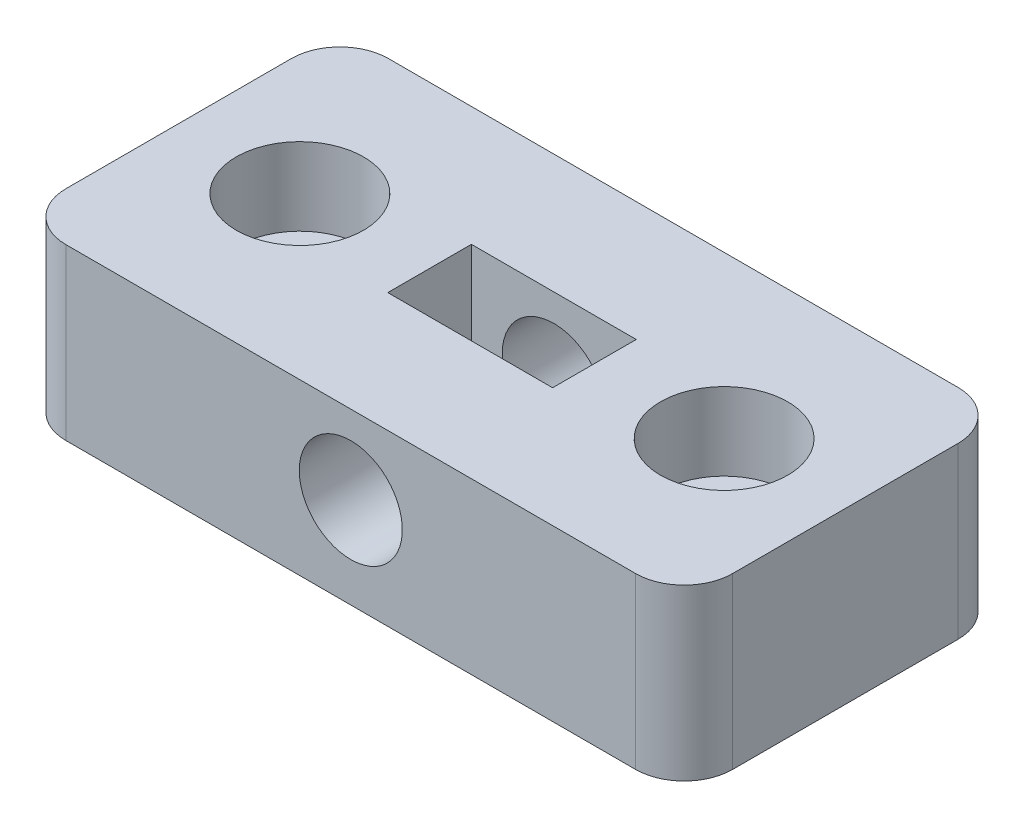
ISO-10303-21;
HEADER;
FILE_DESCRIPTION(('STEP AP214'),'2;1');
FILE_NAME('part.step','',(''),(''),'','','');
FILE_SCHEMA(('AUTOMOTIVE_DESIGN { 1 0 10303 214 1 1 1 1 }'));
ENDSEC;
DATA;
#1=APPLICATION_CONTEXT('core data for automotive mechanical design processes');
#2=APPLICATION_PROTOCOL_DEFINITION('international standard','automotive_design',2000,#1);
#3=PRODUCT_CONTEXT('',#1,'mechanical');
#4=PRODUCT('Part','Part','',(#3));
#5=PRODUCT_RELATED_PRODUCT_CATEGORY('part','',(#4));
#6=PRODUCT_DEFINITION_FORMATION('','',#4);
#7=PRODUCT_DEFINITION_CONTEXT('part definition',#1,'design');
#8=PRODUCT_DEFINITION('design','',#6,#7);
#9=PRODUCT_DEFINITION_SHAPE('','',#8);
#10=(LENGTH_UNIT() NAMED_UNIT(*) SI_UNIT(.MILLI.,.METRE.));
#11=(NAMED_UNIT(*) PLANE_ANGLE_UNIT() SI_UNIT($,.RADIAN.));
#12=(NAMED_UNIT(*) SI_UNIT($,.STERADIAN.) SOLID_ANGLE_UNIT());
#13=UNCERTAINTY_MEASURE_WITH_UNIT(LENGTH_MEASURE(1.E-05),#10,'distance_accuracy_value','');
#14=(GEOMETRIC_REPRESENTATION_CONTEXT(3) GLOBAL_UNCERTAINTY_ASSIGNED_CONTEXT((#13)) GLOBAL_UNIT_ASSIGNED_CONTEXT((#10,
#11,#12)) REPRESENTATION_CONTEXT('',''));
#15=CARTESIAN_POINT('',(0.,0.,0.));
#16=DIRECTION('',(0.,0.,1.));
#17=DIRECTION('',(1.,0.,0.));
#18=AXIS2_PLACEMENT_3D('',#15,#16,#17);
#19=CARTESIAN_POINT('',(17.5,14.,0.));
#20=DIRECTION('',(0.,-1.,0.));
#21=DIRECTION('',(0.,0.,-1.));
#22=AXIS2_PLACEMENT_3D('',#19,#20,#21);
#23=CYLINDRICAL_SURFACE('',#22,3.25);
#24=CARTESIAN_POINT('',(17.5,0.,0.));
#25=DIRECTION('',(0.,1.,0.));
#26=DIRECTION('',(0.,0.,-1.));
#27=AXIS2_PLACEMENT_3D('',#24,#25,#26);
#28=CIRCLE('',#27,3.25);
#29=CARTESIAN_POINT('',(17.5,0.,-3.25));
#30=VERTEX_POINT('',#29);
#31=EDGE_CURVE('E166',#30,#30,#28,.T.);
#32=ORIENTED_EDGE('',*,*,#31,.F.);
#33=EDGE_LOOP('',(#32));
#34=FACE_BOUND('',#33,.T.);
#35=CARTESIAN_POINT('',(17.5,7.6,0.));
#36=DIRECTION('',(0.,1.,0.));
#37=DIRECTION('',(0.,0.,1.));
#38=AXIS2_PLACEMENT_3D('',#35,#36,#37);
#39=CIRCLE('',#38,3.25);
#40=CARTESIAN_POINT('',(17.5,7.6,3.25));
#41=VERTEX_POINT('',#40);
#42=EDGE_CURVE('E206',#41,#41,#39,.T.);
#43=ORIENTED_EDGE('',*,*,#42,.T.);
#44=EDGE_LOOP('',(#43));
#45=FACE_BOUND('',#44,.T.);
#46=ADVANCED_FACE('F33',(#34,#45),#23,.F.);
#47=CARTESIAN_POINT('',(-17.5,14.,0.));
#48=DIRECTION('',(0.,-1.,0.));
#49=DIRECTION('',(0.,0.,-1.));
#50=AXIS2_PLACEMENT_3D('',#47,#48,#49);
#51=CYLINDRICAL_SURFACE('',#50,3.25);
#52=CARTESIAN_POINT('',(-17.5,0.,0.));
#53=DIRECTION('',(0.,1.,0.));
#54=DIRECTION('',(0.,0.,1.));
#55=AXIS2_PLACEMENT_3D('',#52,#53,#54);
#56=CIRCLE('',#55,3.25);
#57=CARTESIAN_POINT('',(-17.5,0.,3.25));
#58=VERTEX_POINT('',#57);
#59=EDGE_CURVE('E172',#58,#58,#56,.T.);
#60=ORIENTED_EDGE('',*,*,#59,.F.);
#61=EDGE_LOOP('',(#60));
#62=FACE_BOUND('',#61,.T.);
#63=CARTESIAN_POINT('',(-17.5,7.6,0.));
#64=DIRECTION('',(0.,1.,0.));
#65=DIRECTION('',(0.,0.,1.));
#66=AXIS2_PLACEMENT_3D('',#63,#64,#65);
#67=CIRCLE('',#66,3.25);
#68=CARTESIAN_POINT('',(-17.5,7.6,3.25));
#69=VERTEX_POINT('',#68);
#70=EDGE_CURVE('E201',#69,#69,#67,.T.);
#71=ORIENTED_EDGE('',*,*,#70,.T.);
#72=EDGE_LOOP('',(#71));
#73=FACE_BOUND('',#72,.T.);
#74=ADVANCED_FACE('F280',(#62,#73),#51,.F.);
#75=CARTESIAN_POINT('',(0.,14.,0.));
#76=DIRECTION('',(0.,1.,0.));
#77=DIRECTION('',(0.,0.,1.));
#78=AXIS2_PLACEMENT_3D('',#75,#76,#77);
#79=PLANE('',#78);
#80=CARTESIAN_POINT('',(17.5,14.,0.));
#81=DIRECTION('',(0.,1.,0.));
#82=DIRECTION('',(0.,0.,1.));
#83=AXIS2_PLACEMENT_3D('',#80,#81,#82);
#84=CIRCLE('',#83,5.25);
#85=CARTESIAN_POINT('',(17.5,14.,5.25));
#86=VERTEX_POINT('',#85);
#87=EDGE_CURVE('E365',#86,#86,#84,.T.);
#88=ORIENTED_EDGE('',*,*,#87,.F.);
#89=EDGE_LOOP('',(#88));
#90=FACE_BOUND('',#89,.T.);
#91=CARTESIAN_POINT('',(-17.5,14.,0.));
#92=DIRECTION('',(0.,1.,0.));
#93=DIRECTION('',(0.,0.,1.));
#94=AXIS2_PLACEMENT_3D('',#91,#92,#93);
#95=CIRCLE('',#94,5.25);
#96=CARTESIAN_POINT('',(-17.5,14.,5.25));
#97=VERTEX_POINT('',#96);
#98=EDGE_CURVE('E209',#97,#97,#95,.T.);
#99=ORIENTED_EDGE('',*,*,#98,.F.);
#100=EDGE_LOOP('',(#99));
#101=FACE_BOUND('',#100,.T.);
#102=DIRECTION('',(0.,0.,-1.));
#103=VECTOR('',#102,1.);
#104=CARTESIAN_POINT('',(6.8,14.,-3.45));
#105=LINE('',#104,#103);
#106=CARTESIAN_POINT('',(6.8,14.,3.45));
#107=VERTEX_POINT('',#106);
#108=CARTESIAN_POINT('',(6.8,14.,-3.45));
#109=VERTEX_POINT('',#108);
#110=EDGE_CURVE('E131',#107,#109,#105,.T.);
#111=ORIENTED_EDGE('',*,*,#110,.F.);
#112=DIRECTION('',(1.,0.,0.));
#113=VECTOR('',#112,1.);
#114=CARTESIAN_POINT('',(-6.8,14.,3.45));
#115=LINE('',#114,#113);
#116=CARTESIAN_POINT('',(-6.8,14.,3.45));
#117=VERTEX_POINT('',#116);
#118=EDGE_CURVE('E148',#117,#107,#115,.T.);
#119=ORIENTED_EDGE('',*,*,#118,.F.);
#120=DIRECTION('',(0.,0.,1.));
#121=VECTOR('',#120,1.);
#122=CARTESIAN_POINT('',(-6.8,14.,-3.45));
#123=LINE('',#122,#121);
#124=CARTESIAN_POINT('',(-6.8,14.,-3.45));
#125=VERTEX_POINT('',#124);
#126=EDGE_CURVE('E151',#125,#117,#123,.T.);
#127=ORIENTED_EDGE('',*,*,#126,.F.);
#128=DIRECTION('',(-1.,0.,0.));
#129=VECTOR('',#128,1.);
#130=CARTESIAN_POINT('',(-6.8,14.,-3.45));
#131=LINE('',#130,#129);
#132=EDGE_CURVE('E160',#109,#125,#131,.T.);
#133=ORIENTED_EDGE('',*,*,#132,.F.);
#134=EDGE_LOOP('',(#111,#119,#127,#133));
#135=FACE_BOUND('',#134,.T.);
#136=DIRECTION('',(0.,0.,1.));
#137=VECTOR('',#136,1.);
#138=CARTESIAN_POINT('',(-27.5,14.,-13.3));
#139=LINE('',#138,#137);
#140=CARTESIAN_POINT('',(-27.5,14.,-9.30000000000001));
#141=VERTEX_POINT('',#140);
#142=CARTESIAN_POINT('',(-27.5,14.,9.29999999999999));
#143=VERTEX_POINT('',#142);
#144=EDGE_CURVE('E181',#141,#143,#139,.T.);
#145=ORIENTED_EDGE('',*,*,#144,.T.);
#146=CARTESIAN_POINT('',(-23.5,14.,9.3));
#147=DIRECTION('',(0.,1.,0.));
#148=DIRECTION('',(0.,0.,1.));
#149=AXIS2_PLACEMENT_3D('',#146,#147,#148);
#150=CIRCLE('',#149,4.);
#151=CARTESIAN_POINT('',(-23.5,14.,13.3));
#152=VERTEX_POINT('',#151);
#153=EDGE_CURVE('E233',#143,#152,#150,.T.);
#154=ORIENTED_EDGE('',*,*,#153,.T.);
#155=DIRECTION('',(1.,0.,0.));
#156=VECTOR('',#155,1.);
#157=CARTESIAN_POINT('',(-27.5,14.,13.3));
#158=LINE('',#157,#156);
#159=CARTESIAN_POINT('',(23.5,14.,13.3));
#160=VERTEX_POINT('',#159);
#161=EDGE_CURVE('E184',#152,#160,#158,.T.);
#162=ORIENTED_EDGE('',*,*,#161,.T.);
#163=CARTESIAN_POINT('',(23.5,14.,9.3));
#164=DIRECTION('',(0.,1.,0.));
#165=DIRECTION('',(0.,0.,1.));
#166=AXIS2_PLACEMENT_3D('',#163,#164,#165);
#167=CIRCLE('',#166,4.);
#168=CARTESIAN_POINT('',(27.5,14.,9.29999999999999));
#169=VERTEX_POINT('',#168);
#170=EDGE_CURVE('E229',#160,#169,#167,.T.);
#171=ORIENTED_EDGE('',*,*,#170,.T.);
#172=DIRECTION('',(0.,0.,-1.));
#173=VECTOR('',#172,1.);
#174=CARTESIAN_POINT('',(27.5,14.,-13.3));
#175=LINE('',#174,#173);
#176=CARTESIAN_POINT('',(27.5,14.,-9.30000000000001));
#177=VERTEX_POINT('',#176);
#178=EDGE_CURVE('E176',#169,#177,#175,.T.);
#179=ORIENTED_EDGE('',*,*,#178,.T.);
#180=CARTESIAN_POINT('',(23.5,14.,-9.3));
#181=DIRECTION('',(0.,1.,0.));
#182=DIRECTION('',(0.,0.,1.));
#183=AXIS2_PLACEMENT_3D('',#180,#181,#182);
#184=CIRCLE('',#183,4.);
#185=CARTESIAN_POINT('',(23.5,14.,-13.3));
#186=VERTEX_POINT('',#185);
#187=EDGE_CURVE('E55',#177,#186,#184,.T.);
#188=ORIENTED_EDGE('',*,*,#187,.T.);
#189=DIRECTION('',(-1.,0.,0.));
#190=VECTOR('',#189,1.);
#191=CARTESIAN_POINT('',(-27.5,14.,-13.3));
#192=LINE('',#191,#190);
#193=CARTESIAN_POINT('',(-23.5,14.,-13.3));
#194=VERTEX_POINT('',#193);
#195=EDGE_CURVE('E178',#186,#194,#192,.T.);
#196=ORIENTED_EDGE('',*,*,#195,.T.);
#197=CARTESIAN_POINT('',(-23.5,14.,-9.3));
#198=DIRECTION('',(0.,1.,0.));
#199=DIRECTION('',(0.,0.,1.));
#200=AXIS2_PLACEMENT_3D('',#197,#198,#199);
#201=CIRCLE('',#200,4.);
#202=EDGE_CURVE('E231',#194,#141,#201,.T.);
#203=ORIENTED_EDGE('',*,*,#202,.T.);
#204=EDGE_LOOP('',(#145,#154,#162,#171,#179,#188,#196,#203));
#205=FACE_BOUND('',#204,.T.);
#206=ADVANCED_FACE('F245',(#90,#101,#135,#205),#79,.T.);
#207=CARTESIAN_POINT('',(0.,0.,0.));
#208=DIRECTION('',(0.,1.,0.));
#209=DIRECTION('',(0.,0.,1.));
#210=AXIS2_PLACEMENT_3D('',#207,#208,#209);
#211=PLANE('',#210);
#212=DIRECTION('',(1.,0.,0.));
#213=VECTOR('',#212,1.);
#214=CARTESIAN_POINT('',(-27.5,0.,13.3));
#215=LINE('',#214,#213);
#216=CARTESIAN_POINT('',(-23.5,0.,13.3));
#217=VERTEX_POINT('',#216);
#218=CARTESIAN_POINT('',(23.5,0.,13.3));
#219=VERTEX_POINT('',#218);
#220=EDGE_CURVE('E179',#217,#219,#215,.T.);
#221=ORIENTED_EDGE('',*,*,#220,.F.);
#222=CARTESIAN_POINT('',(-23.5,0.,9.3));
#223=DIRECTION('',(0.,1.,0.));
#224=DIRECTION('',(0.,0.,1.));
#225=AXIS2_PLACEMENT_3D('',#222,#223,#224);
#226=CIRCLE('',#225,4.);
#227=CARTESIAN_POINT('',(-27.5,0.,9.29999999999999));
#228=VERTEX_POINT('',#227);
#229=EDGE_CURVE('E221',#217,#228,#226,.F.);
#230=ORIENTED_EDGE('',*,*,#229,.T.);
#231=DIRECTION('',(0.,0.,1.));
#232=VECTOR('',#231,1.);
#233=CARTESIAN_POINT('',(-27.5,0.,-13.3));
#234=LINE('',#233,#232);
#235=CARTESIAN_POINT('',(-27.5,0.,-9.30000000000001));
#236=VERTEX_POINT('',#235);
#237=EDGE_CURVE('E192',#236,#228,#234,.T.);
#238=ORIENTED_EDGE('',*,*,#237,.F.);
#239=CARTESIAN_POINT('',(-23.5,0.,-9.3));
#240=DIRECTION('',(0.,1.,0.));
#241=DIRECTION('',(0.,0.,1.));
#242=AXIS2_PLACEMENT_3D('',#239,#240,#241);
#243=CIRCLE('',#242,4.);
#244=CARTESIAN_POINT('',(-23.5,0.,-13.3));
#245=VERTEX_POINT('',#244);
#246=EDGE_CURVE('E219',#236,#245,#243,.F.);
#247=ORIENTED_EDGE('',*,*,#246,.T.);
#248=DIRECTION('',(-1.,0.,0.));
#249=VECTOR('',#248,1.);
#250=CARTESIAN_POINT('',(-27.5,0.,-13.3));
#251=LINE('',#250,#249);
#252=CARTESIAN_POINT('',(23.5,0.,-13.3));
#253=VERTEX_POINT('',#252);
#254=EDGE_CURVE('E190',#253,#245,#251,.T.);
#255=ORIENTED_EDGE('',*,*,#254,.F.);
#256=CARTESIAN_POINT('',(23.5,0.,-9.3));
#257=DIRECTION('',(0.,1.,0.));
#258=DIRECTION('',(0.,0.,1.));
#259=AXIS2_PLACEMENT_3D('',#256,#257,#258);
#260=CIRCLE('',#259,4.);
#261=CARTESIAN_POINT('',(27.5,0.,-9.30000000000001));
#262=VERTEX_POINT('',#261);
#263=EDGE_CURVE('E215',#253,#262,#260,.F.);
#264=ORIENTED_EDGE('',*,*,#263,.T.);
#265=DIRECTION('',(0.,0.,-1.));
#266=VECTOR('',#265,1.);
#267=CARTESIAN_POINT('',(27.5,0.,-13.3));
#268=LINE('',#267,#266);
#269=CARTESIAN_POINT('',(27.5,0.,9.29999999999999));
#270=VERTEX_POINT('',#269);
#271=EDGE_CURVE('E175',#270,#262,#268,.T.);
#272=ORIENTED_EDGE('',*,*,#271,.F.);
#273=CARTESIAN_POINT('',(23.5,0.,9.3));
#274=DIRECTION('',(0.,1.,0.));
#275=DIRECTION('',(0.,0.,1.));
#276=AXIS2_PLACEMENT_3D('',#273,#274,#275);
#277=CIRCLE('',#276,4.);
#278=EDGE_CURVE('E217',#270,#219,#277,.F.);
#279=ORIENTED_EDGE('',*,*,#278,.T.);
#280=EDGE_LOOP('',(#221,#230,#238,#247,#255,#264,#272,#279));
#281=FACE_BOUND('',#280,.T.);
#282=ORIENTED_EDGE('',*,*,#59,.T.);
#283=EDGE_LOOP('',(#282));
#284=FACE_BOUND('',#283,.T.);
#285=ORIENTED_EDGE('',*,*,#31,.T.);
#286=EDGE_LOOP('',(#285));
#287=FACE_BOUND('',#286,.T.);
#288=ADVANCED_FACE('F252',(#281,#284,#287),#211,.F.);
#289=CARTESIAN_POINT('',(27.5,14.,-13.3));
#290=DIRECTION('',(-1.,0.,0.));
#291=DIRECTION('',(0.,0.,1.));
#292=AXIS2_PLACEMENT_3D('',#289,#290,#291);
#293=PLANE('',#292);
#294=ORIENTED_EDGE('',*,*,#178,.F.);
#295=DIRECTION('',(0.,-1.,0.));
#296=VECTOR('',#295,1.);
#297=CARTESIAN_POINT('',(27.5,14.,9.3));
#298=LINE('',#297,#296);
#299=EDGE_CURVE('E11',#169,#270,#298,.T.);
#300=ORIENTED_EDGE('',*,*,#299,.T.);
#301=ORIENTED_EDGE('',*,*,#271,.T.);
#302=DIRECTION('',(0.,-1.,0.));
#303=VECTOR('',#302,1.);
#304=CARTESIAN_POINT('',(27.5,14.,-9.3));
#305=LINE('',#304,#303);
#306=EDGE_CURVE('E41',#262,#177,#305,.F.);
#307=ORIENTED_EDGE('',*,*,#306,.T.);
#308=EDGE_LOOP('',(#294,#300,#301,#307));
#309=FACE_BOUND('',#308,.T.);
#310=ADVANCED_FACE('F241',(#309),#293,.F.);
#311=CARTESIAN_POINT('',(-27.5,14.,-13.3));
#312=DIRECTION('',(0.,0.,1.));
#313=DIRECTION('',(1.,0.,0.));
#314=AXIS2_PLACEMENT_3D('',#311,#312,#313);
#315=PLANE('',#314);
#316=CARTESIAN_POINT('',(0.,7.5,-13.3));
#317=DIRECTION('',(0.,0.,-1.));
#318=DIRECTION('',(-1.,0.,0.));
#319=AXIS2_PLACEMENT_3D('',#316,#317,#318);
#320=CIRCLE('',#319,4.25);
#321=CARTESIAN_POINT('',(-4.25,7.5,-13.3));
#322=VERTEX_POINT('',#321);
#323=EDGE_CURVE('E204',#322,#322,#320,.T.);
#324=ORIENTED_EDGE('',*,*,#323,.F.);
#325=EDGE_LOOP('',(#324));
#326=FACE_BOUND('',#325,.T.);
#327=ORIENTED_EDGE('',*,*,#254,.T.);
#328=DIRECTION('',(0.,-1.,0.));
#329=VECTOR('',#328,1.);
#330=CARTESIAN_POINT('',(-23.5,14.,-13.3));
#331=LINE('',#330,#329);
#332=EDGE_CURVE('E48',#245,#194,#331,.F.);
#333=ORIENTED_EDGE('',*,*,#332,.T.);
#334=ORIENTED_EDGE('',*,*,#195,.F.);
#335=DIRECTION('',(0.,-1.,0.));
#336=VECTOR('',#335,1.);
#337=CARTESIAN_POINT('',(23.5,14.,-13.3));
#338=LINE('',#337,#336);
#339=EDGE_CURVE('E235',#186,#253,#338,.T.);
#340=ORIENTED_EDGE('',*,*,#339,.T.);
#341=EDGE_LOOP('',(#327,#333,#334,#340));
#342=FACE_BOUND('',#341,.T.);
#343=ADVANCED_FACE('F249',(#326,#342),#315,.F.);
#344=CARTESIAN_POINT('',(-27.5,14.,-13.3));
#345=DIRECTION('',(1.,0.,0.));
#346=DIRECTION('',(0.,0.,-1.));
#347=AXIS2_PLACEMENT_3D('',#344,#345,#346);
#348=PLANE('',#347);
#349=ORIENTED_EDGE('',*,*,#237,.T.);
#350=DIRECTION('',(0.,-1.,0.));
#351=VECTOR('',#350,1.);
#352=CARTESIAN_POINT('',(-27.5,14.,9.3));
#353=LINE('',#352,#351);
#354=EDGE_CURVE('E226',#228,#143,#353,.F.);
#355=ORIENTED_EDGE('',*,*,#354,.T.);
#356=ORIENTED_EDGE('',*,*,#144,.F.);
#357=DIRECTION('',(0.,-1.,0.));
#358=VECTOR('',#357,1.);
#359=CARTESIAN_POINT('',(-27.5,14.,-9.3));
#360=LINE('',#359,#358);
#361=EDGE_CURVE('E223',#141,#236,#360,.T.);
#362=ORIENTED_EDGE('',*,*,#361,.T.);
#363=EDGE_LOOP('',(#349,#355,#356,#362));
#364=FACE_BOUND('',#363,.T.);
#365=ADVANCED_FACE('F261',(#364),#348,.F.);
#366=CARTESIAN_POINT('',(-27.5,14.,13.3));
#367=DIRECTION('',(0.,0.,-1.));
#368=DIRECTION('',(-1.,0.,0.));
#369=AXIS2_PLACEMENT_3D('',#366,#367,#368);
#370=PLANE('',#369);
#371=CARTESIAN_POINT('',(0.,7.5,13.3));
#372=DIRECTION('',(0.,0.,-1.));
#373=DIRECTION('',(-1.,0.,0.));
#374=AXIS2_PLACEMENT_3D('',#371,#372,#373);
#375=CIRCLE('',#374,4.25);
#376=CARTESIAN_POINT('',(-4.25,7.5,13.3));
#377=VERTEX_POINT('',#376);
#378=EDGE_CURVE('E200',#377,#377,#375,.T.);
#379=ORIENTED_EDGE('',*,*,#378,.T.);
#380=EDGE_LOOP('',(#379));
#381=FACE_BOUND('',#380,.T.);
#382=ORIENTED_EDGE('',*,*,#161,.F.);
#383=DIRECTION('',(0.,-1.,0.));
#384=VECTOR('',#383,1.);
#385=CARTESIAN_POINT('',(-23.5,14.,13.3));
#386=LINE('',#385,#384);
#387=EDGE_CURVE('E212',#152,#217,#386,.T.);
#388=ORIENTED_EDGE('',*,*,#387,.T.);
#389=ORIENTED_EDGE('',*,*,#220,.T.);
#390=DIRECTION('',(0.,-1.,0.));
#391=VECTOR('',#390,1.);
#392=CARTESIAN_POINT('',(23.5,14.,13.3));
#393=LINE('',#392,#391);
#394=EDGE_CURVE('E187',#219,#160,#393,.F.);
#395=ORIENTED_EDGE('',*,*,#394,.T.);
#396=EDGE_LOOP('',(#382,#388,#389,#395));
#397=FACE_BOUND('',#396,.T.);
#398=ADVANCED_FACE('F269',(#381,#397),#370,.F.);
#399=CARTESIAN_POINT('',(6.8,1.,-3.45));
#400=DIRECTION('',(1.,0.,0.));
#401=DIRECTION('',(0.,0.,-1.));
#402=AXIS2_PLACEMENT_3D('',#399,#400,#401);
#403=PLANE('',#402);
#404=ORIENTED_EDGE('',*,*,#110,.T.);
#405=DIRECTION('',(0.,1.,0.));
#406=VECTOR('',#405,1.);
#407=CARTESIAN_POINT('',(6.8,1.,-3.45));
#408=LINE('',#407,#406);
#409=CARTESIAN_POINT('',(6.8,1.,-3.45));
#410=VERTEX_POINT('',#409);
#411=EDGE_CURVE('E124',#410,#109,#408,.T.);
#412=ORIENTED_EDGE('',*,*,#411,.F.);
#413=DIRECTION('',(0.,0.,-1.));
#414=VECTOR('',#413,1.);
#415=CARTESIAN_POINT('',(6.8,1.,-3.45));
#416=LINE('',#415,#414);
#417=CARTESIAN_POINT('',(6.8,1.,3.45));
#418=VERTEX_POINT('',#417);
#419=EDGE_CURVE('E128',#418,#410,#416,.T.);
#420=ORIENTED_EDGE('',*,*,#419,.F.);
#421=DIRECTION('',(0.,1.,0.));
#422=VECTOR('',#421,1.);
#423=CARTESIAN_POINT('',(6.8,1.,3.45));
#424=LINE('',#423,#422);
#425=EDGE_CURVE('E164',#418,#107,#424,.T.);
#426=ORIENTED_EDGE('',*,*,#425,.T.);
#427=EDGE_LOOP('',(#404,#412,#420,#426));
#428=FACE_BOUND('',#427,.T.);
#429=ADVANCED_FACE('F126',(#428),#403,.F.);
#430=CARTESIAN_POINT('',(-6.8,1.,3.45));
#431=DIRECTION('',(0.,0.,1.));
#432=DIRECTION('',(1.,0.,0.));
#433=AXIS2_PLACEMENT_3D('',#430,#431,#432);
#434=PLANE('',#433);
#435=CARTESIAN_POINT('',(0.,7.5,3.45));
#436=DIRECTION('',(0.,0.,1.));
#437=DIRECTION('',(1.,0.,0.));
#438=AXIS2_PLACEMENT_3D('',#435,#436,#437);
#439=CIRCLE('',#438,4.25);
#440=CARTESIAN_POINT('',(-4.25,7.5,3.45));
#441=VERTEX_POINT('',#440);
#442=EDGE_CURVE('E154',#441,#441,#439,.T.);
#443=ORIENTED_EDGE('',*,*,#442,.T.);
#444=EDGE_LOOP('',(#443));
#445=FACE_BOUND('',#444,.T.);
#446=ORIENTED_EDGE('',*,*,#118,.T.);
#447=ORIENTED_EDGE('',*,*,#425,.F.);
#448=DIRECTION('',(1.,0.,0.));
#449=VECTOR('',#448,1.);
#450=CARTESIAN_POINT('',(-6.8,1.,3.45));
#451=LINE('',#450,#449);
#452=CARTESIAN_POINT('',(-6.8,1.,3.45));
#453=VERTEX_POINT('',#452);
#454=EDGE_CURVE('E136',#453,#418,#451,.T.);
#455=ORIENTED_EDGE('',*,*,#454,.F.);
#456=DIRECTION('',(0.,1.,0.));
#457=VECTOR('',#456,1.);
#458=CARTESIAN_POINT('',(-6.8,1.,3.45));
#459=LINE('',#458,#457);
#460=EDGE_CURVE('E167',#453,#117,#459,.T.);
#461=ORIENTED_EDGE('',*,*,#460,.T.);
#462=EDGE_LOOP('',(#446,#447,#455,#461));
#463=FACE_BOUND('',#462,.T.);
#464=ADVANCED_FACE('F339',(#445,#463),#434,.F.);
#465=CARTESIAN_POINT('',(-6.8,1.,-3.45));
#466=DIRECTION('',(-1.,0.,0.));
#467=DIRECTION('',(0.,0.,1.));
#468=AXIS2_PLACEMENT_3D('',#465,#466,#467);
#469=PLANE('',#468);
#470=ORIENTED_EDGE('',*,*,#126,.T.);
#471=ORIENTED_EDGE('',*,*,#460,.F.);
#472=DIRECTION('',(0.,0.,1.));
#473=VECTOR('',#472,1.);
#474=CARTESIAN_POINT('',(-6.8,1.,-3.45));
#475=LINE('',#474,#473);
#476=CARTESIAN_POINT('',(-6.8,1.,-3.45));
#477=VERTEX_POINT('',#476);
#478=EDGE_CURVE('E144',#477,#453,#475,.T.);
#479=ORIENTED_EDGE('',*,*,#478,.F.);
#480=DIRECTION('',(0.,1.,0.));
#481=VECTOR('',#480,1.);
#482=CARTESIAN_POINT('',(-6.8,1.,-3.45));
#483=LINE('',#482,#481);
#484=EDGE_CURVE('E135',#477,#125,#483,.T.);
#485=ORIENTED_EDGE('',*,*,#484,.T.);
#486=EDGE_LOOP('',(#470,#471,#479,#485));
#487=FACE_BOUND('',#486,.T.);
#488=ADVANCED_FACE('F342',(#487),#469,.F.);
#489=CARTESIAN_POINT('',(-6.8,1.,-3.45));
#490=DIRECTION('',(0.,0.,-1.));
#491=DIRECTION('',(-1.,0.,0.));
#492=AXIS2_PLACEMENT_3D('',#489,#490,#491);
#493=PLANE('',#492);
#494=CARTESIAN_POINT('',(0.,7.5,-3.45));
#495=DIRECTION('',(0.,0.,-1.));
#496=DIRECTION('',(-1.,0.,0.));
#497=AXIS2_PLACEMENT_3D('',#494,#495,#496);
#498=CIRCLE('',#497,4.25);
#499=CARTESIAN_POINT('',(-4.25,7.5,-3.45));
#500=VERTEX_POINT('',#499);
#501=EDGE_CURVE('E197',#500,#500,#498,.T.);
#502=ORIENTED_EDGE('',*,*,#501,.T.);
#503=EDGE_LOOP('',(#502));
#504=FACE_BOUND('',#503,.T.);
#505=ORIENTED_EDGE('',*,*,#132,.T.);
#506=ORIENTED_EDGE('',*,*,#484,.F.);
#507=DIRECTION('',(-1.,0.,0.));
#508=VECTOR('',#507,1.);
#509=CARTESIAN_POINT('',(-6.8,1.,-3.45));
#510=LINE('',#509,#508);
#511=EDGE_CURVE('E139',#410,#477,#510,.T.);
#512=ORIENTED_EDGE('',*,*,#511,.F.);
#513=ORIENTED_EDGE('',*,*,#411,.T.);
#514=EDGE_LOOP('',(#505,#506,#512,#513));
#515=FACE_BOUND('',#514,.T.);
#516=ADVANCED_FACE('F140',(#504,#515),#493,.F.);
#517=CARTESIAN_POINT('',(0.,1.,0.));
#518=DIRECTION('',(0.,1.,0.));
#519=DIRECTION('',(0.,0.,1.));
#520=AXIS2_PLACEMENT_3D('',#517,#518,#519);
#521=PLANE('',#520);
#522=ORIENTED_EDGE('',*,*,#419,.T.);
#523=ORIENTED_EDGE('',*,*,#511,.T.);
#524=ORIENTED_EDGE('',*,*,#478,.T.);
#525=ORIENTED_EDGE('',*,*,#454,.T.);
#526=EDGE_LOOP('',(#522,#523,#524,#525));
#527=FACE_BOUND('',#526,.T.);
#528=ADVANCED_FACE('F146',(#527),#521,.T.);
#529=CARTESIAN_POINT('',(0.,7.5,13.3));
#530=DIRECTION('',(0.,0.,-1.));
#531=DIRECTION('',(-1.,0.,0.));
#532=AXIS2_PLACEMENT_3D('',#529,#530,#531);
#533=CYLINDRICAL_SURFACE('',#532,4.25);
#534=CARTESIAN_POINT('',(-4.25,7.5,-13.3));
#535=CARTESIAN_POINT('',(-4.25,7.5,-13.1973958333333));
#536=CARTESIAN_POINT('',(-4.25,7.5,-13.0947916666667));
#537=CARTESIAN_POINT('',(-4.25,7.5,-12.8895833333333));
#538=CARTESIAN_POINT('',(-4.25,7.5,-12.7869791666667));
#539=CARTESIAN_POINT('',(-4.25,7.5,-12.5817708333333));
#540=CARTESIAN_POINT('',(-4.25,7.5,-12.4791666666667));
#541=CARTESIAN_POINT('',(-4.25,7.5,-12.2739583333333));
#542=CARTESIAN_POINT('',(-4.25,7.5,-12.1713541666667));
#543=CARTESIAN_POINT('',(-4.25,7.5,-11.9661458333333));
#544=CARTESIAN_POINT('',(-4.25,7.5,-11.8635416666667));
#545=CARTESIAN_POINT('',(-4.25,7.5,-11.6583333333333));
#546=CARTESIAN_POINT('',(-4.25,7.5,-11.5557291666667));
#547=CARTESIAN_POINT('',(-4.25,7.5,-11.3505208333333));
#548=CARTESIAN_POINT('',(-4.25,7.5,-11.2479166666667));
#549=CARTESIAN_POINT('',(-4.25,7.5,-11.0427083333333));
#550=CARTESIAN_POINT('',(-4.25,7.5,-10.9401041666667));
#551=CARTESIAN_POINT('',(-4.25,7.5,-10.7348958333333));
#552=CARTESIAN_POINT('',(-4.25,7.5,-10.6322916666667));
#553=CARTESIAN_POINT('',(-4.25,7.5,-10.4270833333333));
#554=CARTESIAN_POINT('',(-4.25,7.5,-10.3244791666667));
#555=CARTESIAN_POINT('',(-4.25,7.5,-10.1192708333333));
#556=CARTESIAN_POINT('',(-4.25,7.5,-10.0166666666667));
#557=CARTESIAN_POINT('',(-4.25,7.5,-9.81145833333333));
#558=CARTESIAN_POINT('',(-4.25,7.5,-9.70885416666667));
#559=CARTESIAN_POINT('',(-4.25,7.5,-9.50364583333333));
#560=CARTESIAN_POINT('',(-4.25,7.5,-9.40104166666667));
#561=CARTESIAN_POINT('',(-4.25,7.5,-9.19583333333333));
#562=CARTESIAN_POINT('',(-4.25,7.5,-9.09322916666666));
#563=CARTESIAN_POINT('',(-4.25,7.5,-8.88802083333333));
#564=CARTESIAN_POINT('',(-4.25,7.5,-8.78541666666666));
#565=CARTESIAN_POINT('',(-4.25,7.5,-8.58020833333333));
#566=CARTESIAN_POINT('',(-4.25,7.5,-8.47760416666667));
#567=CARTESIAN_POINT('',(-4.25,7.5,-8.27239583333333));
#568=CARTESIAN_POINT('',(-4.25,7.5,-8.16979166666667));
#569=CARTESIAN_POINT('',(-4.25,7.5,-7.96458333333333));
#570=CARTESIAN_POINT('',(-4.25,7.5,-7.86197916666667));
#571=CARTESIAN_POINT('',(-4.25,7.5,-7.65677083333333));
#572=CARTESIAN_POINT('',(-4.25,7.5,-7.55416666666666));
#573=CARTESIAN_POINT('',(-4.25,7.5,-7.34895833333333));
#574=CARTESIAN_POINT('',(-4.25,7.5,-7.24635416666666));
#575=CARTESIAN_POINT('',(-4.25,7.5,-7.04114583333333));
#576=CARTESIAN_POINT('',(-4.25,7.5,-6.93854166666666));
#577=CARTESIAN_POINT('',(-4.25,7.5,-6.73333333333333));
#578=CARTESIAN_POINT('',(-4.25,7.5,-6.63072916666666));
#579=CARTESIAN_POINT('',(-4.25,7.5,-6.42552083333333));
#580=CARTESIAN_POINT('',(-4.25,7.5,-6.32291666666666));
#581=CARTESIAN_POINT('',(-4.25,7.5,-6.11770833333333));
#582=CARTESIAN_POINT('',(-4.25,7.5,-6.01510416666666));
#583=CARTESIAN_POINT('',(-4.25,7.5,-5.80989583333333));
#584=CARTESIAN_POINT('',(-4.25,7.5,-5.70729166666666));
#585=CARTESIAN_POINT('',(-4.25,7.5,-5.50208333333333));
#586=CARTESIAN_POINT('',(-4.25,7.5,-5.39947916666666));
#587=CARTESIAN_POINT('',(-4.25,7.5,-5.19427083333333));
#588=CARTESIAN_POINT('',(-4.25,7.5,-5.09166666666666));
#589=CARTESIAN_POINT('',(-4.25,7.5,-4.88645833333333));
#590=CARTESIAN_POINT('',(-4.25,7.5,-4.78385416666666));
#591=CARTESIAN_POINT('',(-4.25,7.5,-4.57864583333333));
#592=CARTESIAN_POINT('',(-4.25,7.5,-4.47604166666666));
#593=CARTESIAN_POINT('',(-4.25,7.5,-4.27083333333333));
#594=CARTESIAN_POINT('',(-4.25,7.5,-4.16822916666666));
#595=CARTESIAN_POINT('',(-4.25,7.5,-3.96302083333333));
#596=CARTESIAN_POINT('',(-4.25,7.5,-3.86041666666666));
#597=CARTESIAN_POINT('',(-4.25,7.5,-3.65520833333333));
#598=CARTESIAN_POINT('',(-4.25,7.5,-3.55260416666666));
#599=CARTESIAN_POINT('',(-4.25,7.5,-3.45));
#600=B_SPLINE_CURVE_WITH_KNOTS('',3,(#534,#535,#536,#537,#538,#539,#540,#541,#542,#543,#544,
#545,#546,#547,#548,#549,#550,#551,#552,#553,#554,#555,#556,#557,#558,#559,#560,#561,#562,#563,
#564,#565,#566,#567,#568,#569,#570,#571,#572,#573,#574,#575,#576,#577,#578,#579,#580,#581,#582,
#583,#584,#585,#586,#587,#588,#589,#590,#591,#592,#593,#594,#595,#596,#597,#598,#599),
.UNSPECIFIED.,.F.,.F.,(4,2,2,2,2,2,2,2,2,2,2,2,2,2,2,2,2,2,2,2,2,2,2,2,2,2,2,2,2,2,2,2,4),(0.,
0.307812500000001,0.615625000000002,0.923437499999999,1.23125,1.5390625,1.846875,2.1546875,
2.4625,2.7703125,3.078125,3.3859375,3.69375,4.0015625,4.309375,4.6171875,4.925,5.2328125,
5.540625,5.8484375,6.15625,6.4640625,6.771875,7.0796875,7.38750000000001,7.6953125,8.003125,
8.3109375,8.61875000000001,8.92656250000001,9.234375,9.5421875,9.85),.UNSPECIFIED.);
#601=EDGE_CURVE('BSEAM335',#322,#500,#600,.T.);
#602=ORIENTED_EDGE('',*,*,#323,.T.);
#603=ORIENTED_EDGE('',*,*,#501,.F.);
#604=ORIENTED_EDGE('',*,*,#601,.T.);
#605=ORIENTED_EDGE('',*,*,#601,.F.);
#606=EDGE_LOOP('',(#602,#604,#603,#605));
#607=FACE_BOUND('',#606,.T.);
#608=ADVANCED_FACE('F335',(#607),#533,.F.);
#609=CARTESIAN_POINT('',(-4.25,7.5,13.3));
#610=CARTESIAN_POINT('',(-4.25,7.5,13.1973958333333));
#611=CARTESIAN_POINT('',(-4.25,7.5,13.0947916666667));
#612=CARTESIAN_POINT('',(-4.25,7.5,12.8895833333333));
#613=CARTESIAN_POINT('',(-4.25,7.5,12.7869791666667));
#614=CARTESIAN_POINT('',(-4.25,7.5,12.5817708333333));
#615=CARTESIAN_POINT('',(-4.25,7.5,12.4791666666667));
#616=CARTESIAN_POINT('',(-4.25,7.5,12.2739583333333));
#617=CARTESIAN_POINT('',(-4.25,7.5,12.1713541666667));
#618=CARTESIAN_POINT('',(-4.25,7.5,11.9661458333333));
#619=CARTESIAN_POINT('',(-4.25,7.5,11.8635416666667));
#620=CARTESIAN_POINT('',(-4.25,7.5,11.6583333333333));
#621=CARTESIAN_POINT('',(-4.25,7.5,11.5557291666667));
#622=CARTESIAN_POINT('',(-4.25,7.5,11.3505208333333));
#623=CARTESIAN_POINT('',(-4.25,7.5,11.2479166666667));
#624=CARTESIAN_POINT('',(-4.25,7.5,11.0427083333333));
#625=CARTESIAN_POINT('',(-4.25,7.5,10.9401041666667));
#626=CARTESIAN_POINT('',(-4.25,7.5,10.7348958333333));
#627=CARTESIAN_POINT('',(-4.25,7.5,10.6322916666667));
#628=CARTESIAN_POINT('',(-4.25,7.5,10.4270833333333));
#629=CARTESIAN_POINT('',(-4.25,7.5,10.3244791666667));
#630=CARTESIAN_POINT('',(-4.25,7.5,10.1192708333333));
#631=CARTESIAN_POINT('',(-4.25,7.5,10.0166666666667));
#632=CARTESIAN_POINT('',(-4.25,7.5,9.81145833333334));
#633=CARTESIAN_POINT('',(-4.25,7.5,9.70885416666667));
#634=CARTESIAN_POINT('',(-4.25,7.5,9.50364583333334));
#635=CARTESIAN_POINT('',(-4.25,7.5,9.40104166666667));
#636=CARTESIAN_POINT('',(-4.25,7.5,9.19583333333333));
#637=CARTESIAN_POINT('',(-4.25,7.5,9.09322916666667));
#638=CARTESIAN_POINT('',(-4.25,7.5,8.88802083333333));
#639=CARTESIAN_POINT('',(-4.25,7.5,8.78541666666667));
#640=CARTESIAN_POINT('',(-4.25,7.5,8.58020833333333));
#641=CARTESIAN_POINT('',(-4.25,7.5,8.47760416666667));
#642=CARTESIAN_POINT('',(-4.25,7.5,8.27239583333333));
#643=CARTESIAN_POINT('',(-4.25,7.5,8.16979166666667));
#644=CARTESIAN_POINT('',(-4.25,7.5,7.96458333333333));
#645=CARTESIAN_POINT('',(-4.25,7.5,7.86197916666667));
#646=CARTESIAN_POINT('',(-4.25,7.5,7.65677083333333));
#647=CARTESIAN_POINT('',(-4.25,7.5,7.55416666666667));
#648=CARTESIAN_POINT('',(-4.25,7.5,7.34895833333333));
#649=CARTESIAN_POINT('',(-4.25,7.5,7.24635416666667));
#650=CARTESIAN_POINT('',(-4.25,7.5,7.04114583333333));
#651=CARTESIAN_POINT('',(-4.25,7.5,6.93854166666667));
#652=CARTESIAN_POINT('',(-4.25,7.5,6.73333333333333));
#653=CARTESIAN_POINT('',(-4.25,7.5,6.63072916666667));
#654=CARTESIAN_POINT('',(-4.25,7.5,6.42552083333333));
#655=CARTESIAN_POINT('',(-4.25,7.5,6.32291666666667));
#656=CARTESIAN_POINT('',(-4.25,7.5,6.11770833333333));
#657=CARTESIAN_POINT('',(-4.25,7.5,6.01510416666667));
#658=CARTESIAN_POINT('',(-4.25,7.5,5.80989583333333));
#659=CARTESIAN_POINT('',(-4.25,7.5,5.70729166666667));
#660=CARTESIAN_POINT('',(-4.25,7.5,5.50208333333333));
#661=CARTESIAN_POINT('',(-4.25,7.5,5.39947916666667));
#662=CARTESIAN_POINT('',(-4.25,7.5,5.19427083333334));
#663=CARTESIAN_POINT('',(-4.25,7.5,5.09166666666667));
#664=CARTESIAN_POINT('',(-4.25,7.5,4.88645833333334));
#665=CARTESIAN_POINT('',(-4.25,7.5,4.78385416666667));
#666=CARTESIAN_POINT('',(-4.25,7.5,4.57864583333333));
#667=CARTESIAN_POINT('',(-4.25,7.5,4.47604166666667));
#668=CARTESIAN_POINT('',(-4.25,7.5,4.27083333333334));
#669=CARTESIAN_POINT('',(-4.25,7.5,4.16822916666667));
#670=CARTESIAN_POINT('',(-4.25,7.5,3.96302083333333));
#671=CARTESIAN_POINT('',(-4.25,7.5,3.86041666666667));
#672=CARTESIAN_POINT('',(-4.25,7.5,3.65520833333334));
#673=CARTESIAN_POINT('',(-4.25,7.5,3.55260416666667));
#674=CARTESIAN_POINT('',(-4.25,7.5,3.45));
#675=B_SPLINE_CURVE_WITH_KNOTS('',3,(#609,#610,#611,#612,#613,#614,#615,#616,#617,#618,#619,
#620,#621,#622,#623,#624,#625,#626,#627,#628,#629,#630,#631,#632,#633,#634,#635,#636,#637,#638,
#639,#640,#641,#642,#643,#644,#645,#646,#647,#648,#649,#650,#651,#652,#653,#654,#655,#656,#657,
#658,#659,#660,#661,#662,#663,#664,#665,#666,#667,#668,#669,#670,#671,#672,#673,#674),
.UNSPECIFIED.,.F.,.F.,(4,2,2,2,2,2,2,2,2,2,2,2,2,2,2,2,2,2,2,2,2,2,2,2,2,2,2,2,2,2,2,2,4),(0.,
0.307812500000001,0.615625000000002,0.923437500000001,1.23125,1.5390625,1.846875,2.1546875,
2.4625,2.7703125,3.078125,3.3859375,3.69375,4.0015625,4.309375,4.6171875,4.925,5.2328125,
5.540625,5.8484375,6.15625,6.4640625,6.771875,7.0796875,7.3875,7.6953125,8.003125,8.3109375,
8.61875,8.9265625,9.234375,9.5421875,9.85),.UNSPECIFIED.);
#676=EDGE_CURVE('BSEAM331',#377,#441,#675,.T.);
#677=ORIENTED_EDGE('',*,*,#378,.F.);
#678=ORIENTED_EDGE('',*,*,#442,.F.);
#679=ORIENTED_EDGE('',*,*,#676,.T.);
#680=ORIENTED_EDGE('',*,*,#676,.F.);
#681=EDGE_LOOP('',(#677,#679,#678,#680));
#682=FACE_BOUND('',#681,.T.);
#683=ADVANCED_FACE('F331',(#682),#533,.F.);
#684=CARTESIAN_POINT('',(-17.5,7.6,0.));
#685=DIRECTION('',(0.,1.,0.));
#686=DIRECTION('',(0.,0.,1.));
#687=AXIS2_PLACEMENT_3D('',#684,#685,#686);
#688=CYLINDRICAL_SURFACE('',#687,5.25);
#689=CARTESIAN_POINT('',(-17.5,7.6,0.));
#690=DIRECTION('',(0.,1.,0.));
#691=DIRECTION('',(0.,0.,1.));
#692=AXIS2_PLACEMENT_3D('',#689,#690,#691);
#693=CIRCLE('',#692,5.25);
#694=CARTESIAN_POINT('',(-17.5,7.6,5.25));
#695=VERTEX_POINT('',#694);
#696=EDGE_CURVE('E205',#695,#695,#693,.T.);
#697=ORIENTED_EDGE('',*,*,#696,.F.);
#698=EDGE_LOOP('',(#697));
#699=FACE_BOUND('',#698,.T.);
#700=ORIENTED_EDGE('',*,*,#98,.T.);
#701=EDGE_LOOP('',(#700));
#702=FACE_BOUND('',#701,.T.);
#703=ADVANCED_FACE('F327',(#699,#702),#688,.F.);
#704=CARTESIAN_POINT('',(-17.5,7.6,0.));
#705=DIRECTION('',(0.,1.,0.));
#706=DIRECTION('',(0.,0.,1.));
#707=AXIS2_PLACEMENT_3D('',#704,#705,#706);
#708=PLANE('',#707);
#709=ORIENTED_EDGE('',*,*,#70,.F.);
#710=EDGE_LOOP('',(#709));
#711=FACE_BOUND('',#710,.T.);
#712=ORIENTED_EDGE('',*,*,#696,.T.);
#713=EDGE_LOOP('',(#712));
#714=FACE_BOUND('',#713,.T.);
#715=ADVANCED_FACE('F319',(#711,#714),#708,.T.);
#716=CARTESIAN_POINT('',(17.5,7.6,0.));
#717=DIRECTION('',(0.,1.,0.));
#718=DIRECTION('',(0.,0.,1.));
#719=AXIS2_PLACEMENT_3D('',#716,#717,#718);
#720=CYLINDRICAL_SURFACE('',#719,5.25);
#721=CARTESIAN_POINT('',(17.5,7.6,0.));
#722=DIRECTION('',(0.,1.,0.));
#723=DIRECTION('',(0.,0.,1.));
#724=AXIS2_PLACEMENT_3D('',#721,#722,#723);
#725=CIRCLE('',#724,5.25);
#726=CARTESIAN_POINT('',(17.5,7.6,5.25));
#727=VERTEX_POINT('',#726);
#728=EDGE_CURVE('E210',#727,#727,#725,.T.);
#729=ORIENTED_EDGE('',*,*,#728,.F.);
#730=EDGE_LOOP('',(#729));
#731=FACE_BOUND('',#730,.T.);
#732=ORIENTED_EDGE('',*,*,#87,.T.);
#733=EDGE_LOOP('',(#732));
#734=FACE_BOUND('',#733,.T.);
#735=ADVANCED_FACE('F313',(#731,#734),#720,.F.);
#736=CARTESIAN_POINT('',(17.5,7.6,0.));
#737=DIRECTION('',(0.,1.,0.));
#738=DIRECTION('',(0.,0.,1.));
#739=AXIS2_PLACEMENT_3D('',#736,#737,#738);
#740=PLANE('',#739);
#741=ORIENTED_EDGE('',*,*,#42,.F.);
#742=EDGE_LOOP('',(#741));
#743=FACE_BOUND('',#742,.T.);
#744=ORIENTED_EDGE('',*,*,#728,.T.);
#745=EDGE_LOOP('',(#744));
#746=FACE_BOUND('',#745,.T.);
#747=ADVANCED_FACE('F309',(#743,#746),#740,.T.);
#748=CARTESIAN_POINT('',(-23.5,14.,9.3));
#749=DIRECTION('',(0.,-1.,0.));
#750=DIRECTION('',(0.,0.,-1.));
#751=AXIS2_PLACEMENT_3D('',#748,#749,#750);
#752=CYLINDRICAL_SURFACE('',#751,4.);
#753=ORIENTED_EDGE('',*,*,#153,.F.);
#754=ORIENTED_EDGE('',*,*,#354,.F.);
#755=ORIENTED_EDGE('',*,*,#229,.F.);
#756=ORIENTED_EDGE('',*,*,#387,.F.);
#757=EDGE_LOOP('',(#753,#754,#755,#756));
#758=FACE_BOUND('',#757,.T.);
#759=ADVANCED_FACE('F267',(#758),#752,.T.);
#760=CARTESIAN_POINT('',(-23.5,14.,-9.3));
#761=DIRECTION('',(0.,-1.,0.));
#762=DIRECTION('',(0.,0.,-1.));
#763=AXIS2_PLACEMENT_3D('',#760,#761,#762);
#764=CYLINDRICAL_SURFACE('',#763,4.);
#765=ORIENTED_EDGE('',*,*,#202,.F.);
#766=ORIENTED_EDGE('',*,*,#332,.F.);
#767=ORIENTED_EDGE('',*,*,#246,.F.);
#768=ORIENTED_EDGE('',*,*,#361,.F.);
#769=EDGE_LOOP('',(#765,#766,#767,#768));
#770=FACE_BOUND('',#769,.T.);
#771=ADVANCED_FACE('F258',(#770),#764,.T.);
#772=CARTESIAN_POINT('',(23.5,14.,9.3));
#773=DIRECTION('',(0.,-1.,0.));
#774=DIRECTION('',(0.,0.,-1.));
#775=AXIS2_PLACEMENT_3D('',#772,#773,#774);
#776=CYLINDRICAL_SURFACE('',#775,4.);
#777=ORIENTED_EDGE('',*,*,#170,.F.);
#778=ORIENTED_EDGE('',*,*,#394,.F.);
#779=ORIENTED_EDGE('',*,*,#278,.F.);
#780=ORIENTED_EDGE('',*,*,#299,.F.);
#781=EDGE_LOOP('',(#777,#778,#779,#780));
#782=FACE_BOUND('',#781,.T.);
#783=ADVANCED_FACE('F272',(#782),#776,.T.);
#784=CARTESIAN_POINT('',(23.5,14.,-9.3));
#785=DIRECTION('',(0.,-1.,0.));
#786=DIRECTION('',(0.,0.,-1.));
#787=AXIS2_PLACEMENT_3D('',#784,#785,#786);
#788=CYLINDRICAL_SURFACE('',#787,4.);
#789=ORIENTED_EDGE('',*,*,#187,.F.);
#790=ORIENTED_EDGE('',*,*,#306,.F.);
#791=ORIENTED_EDGE('',*,*,#263,.F.);
#792=ORIENTED_EDGE('',*,*,#339,.F.);
#793=EDGE_LOOP('',(#789,#790,#791,#792));
#794=FACE_BOUND('',#793,.T.);
#795=ADVANCED_FACE('F35',(#794),#788,.T.);
#796=CLOSED_SHELL('',(#46,#74,#206,#288,#310,#343,#365,#398,#429,#464,#488,#516,#528,#608,#683,
#703,#715,#735,#747,#759,#771,#783,#795));
#797=MANIFOLD_SOLID_BREP('B2',#796);
#798=ADVANCED_BREP_SHAPE_REPRESENTATION('',(#18,#797),#14);
#799=SHAPE_DEFINITION_REPRESENTATION(#9,#798);
ENDSEC;
END-ISO-10303-21;
